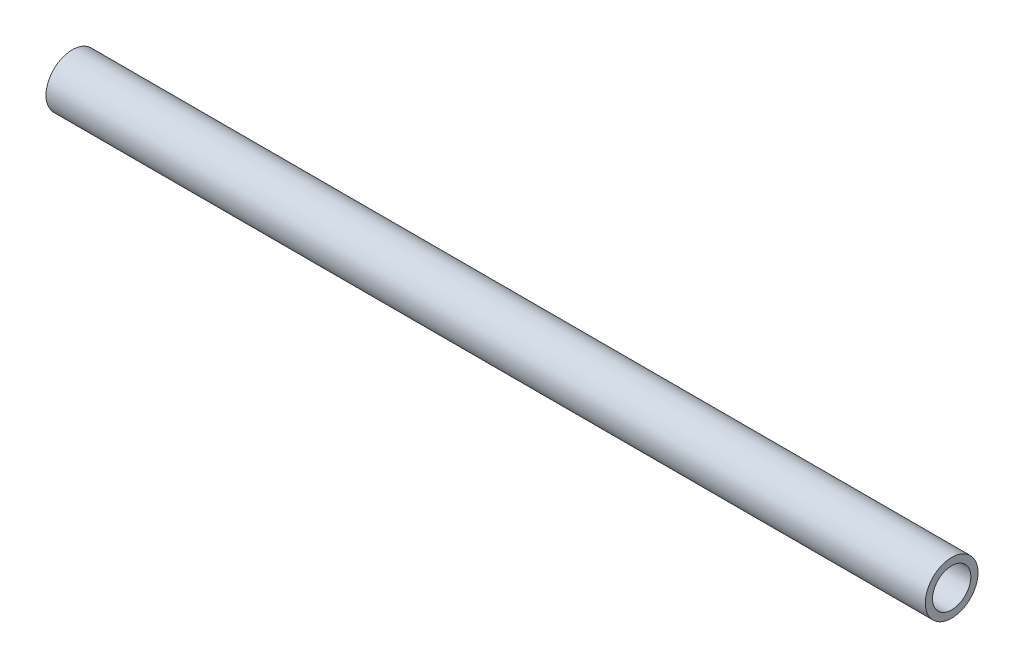
ISO-10303-21;
HEADER;
FILE_DESCRIPTION(('STEP AP214'),'2;1');
FILE_NAME('part.step','',(''),(''),'','','');
FILE_SCHEMA(('AUTOMOTIVE_DESIGN { 1 0 10303 214 1 1 1 1 }'));
ENDSEC;
DATA;
#1=APPLICATION_CONTEXT('core data for automotive mechanical design processes');
#2=APPLICATION_PROTOCOL_DEFINITION('international standard','automotive_design',2000,#1);
#3=PRODUCT_CONTEXT('',#1,'mechanical');
#4=PRODUCT('Part','Part','',(#3));
#5=PRODUCT_RELATED_PRODUCT_CATEGORY('part','',(#4));
#6=PRODUCT_DEFINITION_FORMATION('','',#4);
#7=PRODUCT_DEFINITION_CONTEXT('part definition',#1,'design');
#8=PRODUCT_DEFINITION('design','',#6,#7);
#9=PRODUCT_DEFINITION_SHAPE('','',#8);
#10=(LENGTH_UNIT() NAMED_UNIT(*) SI_UNIT(.MILLI.,.METRE.));
#11=(NAMED_UNIT(*) PLANE_ANGLE_UNIT() SI_UNIT($,.RADIAN.));
#12=(NAMED_UNIT(*) SI_UNIT($,.STERADIAN.) SOLID_ANGLE_UNIT());
#13=UNCERTAINTY_MEASURE_WITH_UNIT(LENGTH_MEASURE(1.E-05),#10,'distance_accuracy_value','');
#14=(GEOMETRIC_REPRESENTATION_CONTEXT(3) GLOBAL_UNCERTAINTY_ASSIGNED_CONTEXT((#13)) GLOBAL_UNIT_ASSIGNED_CONTEXT((#10,
#11,#12)) REPRESENTATION_CONTEXT('',''));
#15=CARTESIAN_POINT('',(0.,0.,0.));
#16=DIRECTION('',(0.,0.,1.));
#17=DIRECTION('',(1.,0.,0.));
#18=AXIS2_PLACEMENT_3D('',#15,#16,#17);
#19=CARTESIAN_POINT('',(438.4,0.,0.));
#20=DIRECTION('',(1.,0.,0.));
#21=DIRECTION('',(0.,0.,-1.));
#22=AXIS2_PLACEMENT_3D('',#19,#20,#21);
#23=PLANE('',#22);
#24=CARTESIAN_POINT('',(438.4,0.,0.));
#25=DIRECTION('',(1.,0.,0.));
#26=DIRECTION('',(0.,0.,-1.));
#27=AXIS2_PLACEMENT_3D('',#24,#25,#26);
#28=CIRCLE('',#27,13.15);
#29=CARTESIAN_POINT('',(438.4,0.,13.15));
#30=VERTEX_POINT('',#29);
#31=EDGE_CURVE('E10',#30,#30,#28,.T.);
#32=ORIENTED_EDGE('',*,*,#31,.T.);
#33=EDGE_LOOP('',(#32));
#34=FACE_BOUND('',#33,.T.);
#35=CARTESIAN_POINT('',(438.4,0.,0.));
#36=DIRECTION('',(1.,0.,0.));
#37=DIRECTION('',(0.,0.,-1.));
#38=AXIS2_PLACEMENT_3D('',#35,#36,#37);
#39=CIRCLE('',#38,9.55);
#40=CARTESIAN_POINT('',(438.4,0.,9.55));
#41=VERTEX_POINT('',#40);
#42=EDGE_CURVE('E44',#41,#41,#39,.T.);
#43=ORIENTED_EDGE('',*,*,#42,.F.);
#44=EDGE_LOOP('',(#43));
#45=FACE_BOUND('',#44,.T.);
#46=ADVANCED_FACE('F33',(#34,#45),#23,.T.);
#47=CARTESIAN_POINT('',(0.,0.,0.));
#48=DIRECTION('',(1.,0.,0.));
#49=DIRECTION('',(0.,0.,-1.));
#50=AXIS2_PLACEMENT_3D('',#47,#48,#49);
#51=PLANE('',#50);
#52=CARTESIAN_POINT('',(0.,0.,0.));
#53=DIRECTION('',(1.,0.,0.));
#54=DIRECTION('',(0.,0.,-1.));
#55=AXIS2_PLACEMENT_3D('',#52,#53,#54);
#56=CIRCLE('',#55,13.15);
#57=CARTESIAN_POINT('',(0.,0.,13.15));
#58=VERTEX_POINT('',#57);
#59=EDGE_CURVE('E37',#58,#58,#56,.T.);
#60=ORIENTED_EDGE('',*,*,#59,.F.);
#61=EDGE_LOOP('',(#60));
#62=FACE_BOUND('',#61,.T.);
#63=CARTESIAN_POINT('',(0.,0.,0.));
#64=DIRECTION('',(1.,0.,0.));
#65=DIRECTION('',(0.,0.,-1.));
#66=AXIS2_PLACEMENT_3D('',#63,#64,#65);
#67=CIRCLE('',#66,9.55);
#68=CARTESIAN_POINT('',(0.,0.,9.55));
#69=VERTEX_POINT('',#68);
#70=EDGE_CURVE('E46',#69,#69,#67,.T.);
#71=ORIENTED_EDGE('',*,*,#70,.T.);
#72=EDGE_LOOP('',(#71));
#73=FACE_BOUND('',#72,.T.);
#74=ADVANCED_FACE('F56',(#62,#73),#51,.F.);
#75=CARTESIAN_POINT('',(438.4,0.,0.));
#76=DIRECTION('',(-1.,0.,0.));
#77=DIRECTION('',(0.,0.,1.));
#78=AXIS2_PLACEMENT_3D('',#75,#76,#77);
#79=CYLINDRICAL_SURFACE('',#78,13.15);
#80=CARTESIAN_POINT('',(438.4,0.,13.15));
#81=CARTESIAN_POINT('',(433.833333333333,0.,13.15));
#82=CARTESIAN_POINT('',(429.266666666667,0.,13.15));
#83=CARTESIAN_POINT('',(420.133333333333,0.,13.15));
#84=CARTESIAN_POINT('',(415.566666666667,0.,13.15));
#85=CARTESIAN_POINT('',(406.433333333333,0.,13.15));
#86=CARTESIAN_POINT('',(401.866666666667,0.,13.15));
#87=CARTESIAN_POINT('',(392.733333333333,0.,13.15));
#88=CARTESIAN_POINT('',(388.166666666667,0.,13.15));
#89=CARTESIAN_POINT('',(379.033333333333,0.,13.15));
#90=CARTESIAN_POINT('',(374.466666666667,0.,13.15));
#91=CARTESIAN_POINT('',(365.333333333333,0.,13.15));
#92=CARTESIAN_POINT('',(360.766666666667,0.,13.15));
#93=CARTESIAN_POINT('',(351.633333333333,0.,13.15));
#94=CARTESIAN_POINT('',(347.066666666667,0.,13.15));
#95=CARTESIAN_POINT('',(337.933333333333,0.,13.15));
#96=CARTESIAN_POINT('',(333.366666666667,0.,13.15));
#97=CARTESIAN_POINT('',(324.233333333333,0.,13.15));
#98=CARTESIAN_POINT('',(319.666666666667,0.,13.15));
#99=CARTESIAN_POINT('',(310.533333333333,0.,13.15));
#100=CARTESIAN_POINT('',(305.966666666667,0.,13.15));
#101=CARTESIAN_POINT('',(296.833333333333,0.,13.15));
#102=CARTESIAN_POINT('',(292.266666666667,0.,13.15));
#103=CARTESIAN_POINT('',(283.133333333333,0.,13.15));
#104=CARTESIAN_POINT('',(278.566666666667,0.,13.15));
#105=CARTESIAN_POINT('',(269.433333333333,0.,13.15));
#106=CARTESIAN_POINT('',(264.866666666667,0.,13.15));
#107=CARTESIAN_POINT('',(255.733333333333,0.,13.15));
#108=CARTESIAN_POINT('',(251.166666666667,0.,13.15));
#109=CARTESIAN_POINT('',(242.033333333333,0.,13.15));
#110=CARTESIAN_POINT('',(237.466666666667,0.,13.15));
#111=CARTESIAN_POINT('',(228.333333333333,0.,13.15));
#112=CARTESIAN_POINT('',(223.766666666667,0.,13.15));
#113=CARTESIAN_POINT('',(214.633333333333,0.,13.15));
#114=CARTESIAN_POINT('',(210.066666666667,0.,13.15));
#115=CARTESIAN_POINT('',(200.933333333333,0.,13.15));
#116=CARTESIAN_POINT('',(196.366666666667,0.,13.15));
#117=CARTESIAN_POINT('',(187.233333333333,0.,13.15));
#118=CARTESIAN_POINT('',(182.666666666667,0.,13.15));
#119=CARTESIAN_POINT('',(173.533333333333,0.,13.15));
#120=CARTESIAN_POINT('',(168.966666666667,0.,13.15));
#121=CARTESIAN_POINT('',(159.833333333333,0.,13.15));
#122=CARTESIAN_POINT('',(155.266666666667,0.,13.15));
#123=CARTESIAN_POINT('',(146.133333333333,0.,13.15));
#124=CARTESIAN_POINT('',(141.566666666667,0.,13.15));
#125=CARTESIAN_POINT('',(132.433333333333,0.,13.15));
#126=CARTESIAN_POINT('',(127.866666666667,0.,13.15));
#127=CARTESIAN_POINT('',(118.733333333333,0.,13.15));
#128=CARTESIAN_POINT('',(114.166666666667,0.,13.15));
#129=CARTESIAN_POINT('',(105.033333333333,0.,13.15));
#130=CARTESIAN_POINT('',(100.466666666667,0.,13.15));
#131=CARTESIAN_POINT('',(91.3333333333333,0.,13.15));
#132=CARTESIAN_POINT('',(86.7666666666667,0.,13.15));
#133=CARTESIAN_POINT('',(77.6333333333333,0.,13.15));
#134=CARTESIAN_POINT('',(73.0666666666667,0.,13.15));
#135=CARTESIAN_POINT('',(63.9333333333333,0.,13.15));
#136=CARTESIAN_POINT('',(59.3666666666667,0.,13.15));
#137=CARTESIAN_POINT('',(50.2333333333333,0.,13.15));
#138=CARTESIAN_POINT('',(45.6666666666667,0.,13.15));
#139=CARTESIAN_POINT('',(36.5333333333333,0.,13.15));
#140=CARTESIAN_POINT('',(31.9666666666667,0.,13.15));
#141=CARTESIAN_POINT('',(22.8333333333333,0.,13.15));
#142=CARTESIAN_POINT('',(18.2666666666667,0.,13.15));
#143=CARTESIAN_POINT('',(9.13333333333333,0.,13.15));
#144=CARTESIAN_POINT('',(4.56666666666667,0.,13.15));
#145=CARTESIAN_POINT('',(0.,0.,13.15));
#146=B_SPLINE_CURVE_WITH_KNOTS('',3,(#80,#81,#82,#83,#84,#85,#86,#87,#88,#89,#90,#91,#92,#93,
#94,#95,#96,#97,#98,#99,#100,#101,#102,#103,#104,#105,#106,#107,#108,#109,#110,#111,#112,#113,
#114,#115,#116,#117,#118,#119,#120,#121,#122,#123,#124,#125,#126,#127,#128,#129,#130,#131,#132,
#133,#134,#135,#136,#137,#138,#139,#140,#141,#142,#143,#144,#145),.UNSPECIFIED.,.F.,.F.,(4,2,2,
2,2,2,2,2,2,2,2,2,2,2,2,2,2,2,2,2,2,2,2,2,2,2,2,2,2,2,2,2,4),(0.,13.7,27.4,41.1,54.8,68.5,82.2,
95.9,109.6,123.3,137.,150.7,164.4,178.1,191.8,205.5,219.2,232.9,246.6,260.3,274.,287.7,301.4,
315.1,328.8,342.5,356.2,369.9,383.6,397.3,411.,424.7,438.4),.UNSPECIFIED.);
#147=EDGE_CURVE('BSEAM35',#30,#58,#146,.T.);
#148=ORIENTED_EDGE('',*,*,#31,.F.);
#149=ORIENTED_EDGE('',*,*,#59,.T.);
#150=ORIENTED_EDGE('',*,*,#147,.T.);
#151=ORIENTED_EDGE('',*,*,#147,.F.);
#152=EDGE_LOOP('',(#148,#150,#149,#151));
#153=FACE_BOUND('',#152,.T.);
#154=ADVANCED_FACE('F35',(#153),#79,.T.);
#155=CARTESIAN_POINT('',(438.4,0.,0.));
#156=DIRECTION('',(-1.,0.,0.));
#157=DIRECTION('',(0.,0.,1.));
#158=AXIS2_PLACEMENT_3D('',#155,#156,#157);
#159=CYLINDRICAL_SURFACE('',#158,9.55);
#160=CARTESIAN_POINT('',(438.4,0.,9.55));
#161=CARTESIAN_POINT('',(433.833333333333,0.,9.55));
#162=CARTESIAN_POINT('',(429.266666666667,0.,9.55));
#163=CARTESIAN_POINT('',(420.133333333333,0.,9.55));
#164=CARTESIAN_POINT('',(415.566666666667,0.,9.55));
#165=CARTESIAN_POINT('',(406.433333333333,0.,9.55));
#166=CARTESIAN_POINT('',(401.866666666667,0.,9.55));
#167=CARTESIAN_POINT('',(392.733333333333,0.,9.55));
#168=CARTESIAN_POINT('',(388.166666666667,0.,9.55));
#169=CARTESIAN_POINT('',(379.033333333333,0.,9.55));
#170=CARTESIAN_POINT('',(374.466666666667,0.,9.55));
#171=CARTESIAN_POINT('',(365.333333333333,0.,9.55));
#172=CARTESIAN_POINT('',(360.766666666667,0.,9.55));
#173=CARTESIAN_POINT('',(351.633333333333,0.,9.55));
#174=CARTESIAN_POINT('',(347.066666666667,0.,9.55));
#175=CARTESIAN_POINT('',(337.933333333333,0.,9.55));
#176=CARTESIAN_POINT('',(333.366666666667,0.,9.55));
#177=CARTESIAN_POINT('',(324.233333333333,0.,9.55));
#178=CARTESIAN_POINT('',(319.666666666667,0.,9.55));
#179=CARTESIAN_POINT('',(310.533333333333,0.,9.55));
#180=CARTESIAN_POINT('',(305.966666666667,0.,9.55));
#181=CARTESIAN_POINT('',(296.833333333333,0.,9.55));
#182=CARTESIAN_POINT('',(292.266666666667,0.,9.55));
#183=CARTESIAN_POINT('',(283.133333333333,0.,9.55));
#184=CARTESIAN_POINT('',(278.566666666667,0.,9.55));
#185=CARTESIAN_POINT('',(269.433333333333,0.,9.55));
#186=CARTESIAN_POINT('',(264.866666666667,0.,9.55));
#187=CARTESIAN_POINT('',(255.733333333333,0.,9.55));
#188=CARTESIAN_POINT('',(251.166666666667,0.,9.55));
#189=CARTESIAN_POINT('',(242.033333333333,0.,9.55));
#190=CARTESIAN_POINT('',(237.466666666667,0.,9.55));
#191=CARTESIAN_POINT('',(228.333333333333,0.,9.55));
#192=CARTESIAN_POINT('',(223.766666666667,0.,9.55));
#193=CARTESIAN_POINT('',(214.633333333333,0.,9.55));
#194=CARTESIAN_POINT('',(210.066666666667,0.,9.55));
#195=CARTESIAN_POINT('',(200.933333333333,0.,9.55));
#196=CARTESIAN_POINT('',(196.366666666667,0.,9.55));
#197=CARTESIAN_POINT('',(187.233333333333,0.,9.55));
#198=CARTESIAN_POINT('',(182.666666666667,0.,9.55));
#199=CARTESIAN_POINT('',(173.533333333333,0.,9.55));
#200=CARTESIAN_POINT('',(168.966666666667,0.,9.55));
#201=CARTESIAN_POINT('',(159.833333333333,0.,9.55));
#202=CARTESIAN_POINT('',(155.266666666667,0.,9.55));
#203=CARTESIAN_POINT('',(146.133333333333,0.,9.55));
#204=CARTESIAN_POINT('',(141.566666666667,0.,9.55));
#205=CARTESIAN_POINT('',(132.433333333333,0.,9.55));
#206=CARTESIAN_POINT('',(127.866666666667,0.,9.55));
#207=CARTESIAN_POINT('',(118.733333333333,0.,9.55));
#208=CARTESIAN_POINT('',(114.166666666667,0.,9.55));
#209=CARTESIAN_POINT('',(105.033333333333,0.,9.55));
#210=CARTESIAN_POINT('',(100.466666666667,0.,9.55));
#211=CARTESIAN_POINT('',(91.3333333333333,0.,9.55));
#212=CARTESIAN_POINT('',(86.7666666666667,0.,9.55));
#213=CARTESIAN_POINT('',(77.6333333333333,0.,9.55));
#214=CARTESIAN_POINT('',(73.0666666666667,0.,9.55));
#215=CARTESIAN_POINT('',(63.9333333333333,0.,9.55));
#216=CARTESIAN_POINT('',(59.3666666666667,0.,9.55));
#217=CARTESIAN_POINT('',(50.2333333333333,0.,9.55));
#218=CARTESIAN_POINT('',(45.6666666666667,0.,9.55));
#219=CARTESIAN_POINT('',(36.5333333333333,0.,9.55));
#220=CARTESIAN_POINT('',(31.9666666666667,0.,9.55));
#221=CARTESIAN_POINT('',(22.8333333333333,0.,9.55));
#222=CARTESIAN_POINT('',(18.2666666666667,0.,9.55));
#223=CARTESIAN_POINT('',(9.13333333333333,0.,9.55));
#224=CARTESIAN_POINT('',(4.56666666666667,0.,9.55));
#225=CARTESIAN_POINT('',(0.,0.,9.55));
#226=B_SPLINE_CURVE_WITH_KNOTS('',3,(#160,#161,#162,#163,#164,#165,#166,#167,#168,#169,#170,
#171,#172,#173,#174,#175,#176,#177,#178,#179,#180,#181,#182,#183,#184,#185,#186,#187,#188,#189,
#190,#191,#192,#193,#194,#195,#196,#197,#198,#199,#200,#201,#202,#203,#204,#205,#206,#207,#208,
#209,#210,#211,#212,#213,#214,#215,#216,#217,#218,#219,#220,#221,#222,#223,#224,#225),
.UNSPECIFIED.,.F.,.F.,(4,2,2,2,2,2,2,2,2,2,2,2,2,2,2,2,2,2,2,2,2,2,2,2,2,2,2,2,2,2,2,2,4),(0.,
13.7,27.4,41.1,54.8,68.5,82.2,95.9,109.6,123.3,137.,150.7,164.4,178.1,191.8,205.5,219.2,232.9,
246.6,260.3,274.,287.7,301.4,315.1,328.8,342.5,356.2,369.9,383.6,397.3,411.,424.7,438.4),.UNSPECIFIED.);
#227=EDGE_CURVE('BSEAM52',#41,#69,#226,.T.);
#228=ORIENTED_EDGE('',*,*,#42,.T.);
#229=ORIENTED_EDGE('',*,*,#70,.F.);
#230=ORIENTED_EDGE('',*,*,#227,.T.);
#231=ORIENTED_EDGE('',*,*,#227,.F.);
#232=EDGE_LOOP('',(#228,#230,#229,#231));
#233=FACE_BOUND('',#232,.T.);
#234=ADVANCED_FACE('F52',(#233),#159,.F.);
#235=CLOSED_SHELL('',(#46,#74,#154,#234));
#236=MANIFOLD_SOLID_BREP('B2',#235);
#237=ADVANCED_BREP_SHAPE_REPRESENTATION('',(#18,#236),#14);
#238=SHAPE_DEFINITION_REPRESENTATION(#9,#237);
ENDSEC;
END-ISO-10303-21;
